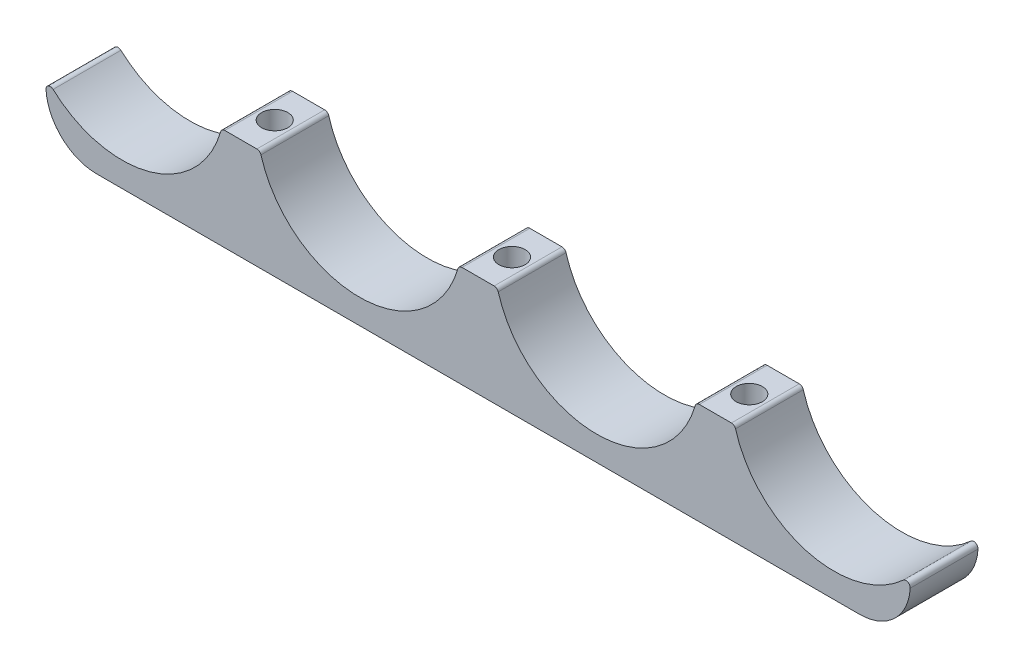
ISO-10303-21;
HEADER;
FILE_DESCRIPTION(('STEP AP214'),'2;1');
FILE_NAME('part.step','',(''),(''),'','','');
FILE_SCHEMA(('AUTOMOTIVE_DESIGN { 1 0 10303 214 1 1 1 1 }'));
ENDSEC;
DATA;
#1=APPLICATION_CONTEXT('core data for automotive mechanical design processes');
#2=APPLICATION_PROTOCOL_DEFINITION('international standard','automotive_design',2000,#1);
#3=PRODUCT_CONTEXT('',#1,'mechanical');
#4=PRODUCT('Part','Part','',(#3));
#5=PRODUCT_RELATED_PRODUCT_CATEGORY('part','',(#4));
#6=PRODUCT_DEFINITION_FORMATION('','',#4);
#7=PRODUCT_DEFINITION_CONTEXT('part definition',#1,'design');
#8=PRODUCT_DEFINITION('design','',#6,#7);
#9=PRODUCT_DEFINITION_SHAPE('','',#8);
#10=(LENGTH_UNIT() NAMED_UNIT(*) SI_UNIT(.MILLI.,.METRE.));
#11=(NAMED_UNIT(*) PLANE_ANGLE_UNIT() SI_UNIT($,.RADIAN.));
#12=(NAMED_UNIT(*) SI_UNIT($,.STERADIAN.) SOLID_ANGLE_UNIT());
#13=UNCERTAINTY_MEASURE_WITH_UNIT(LENGTH_MEASURE(1.E-05),#10,'distance_accuracy_value','');
#14=(GEOMETRIC_REPRESENTATION_CONTEXT(3) GLOBAL_UNCERTAINTY_ASSIGNED_CONTEXT((#13)) GLOBAL_UNIT_ASSIGNED_CONTEXT((#10,
#11,#12)) REPRESENTATION_CONTEXT('',''));
#15=CARTESIAN_POINT('',(0.,0.,0.));
#16=DIRECTION('',(0.,0.,1.));
#17=DIRECTION('',(1.,0.,0.));
#18=AXIS2_PLACEMENT_3D('',#15,#16,#17);
#19=CARTESIAN_POINT('',(-14.,15.,4.));
#20=DIRECTION('',(0.,0.,-1.));
#21=DIRECTION('',(-1.,0.,0.));
#22=AXIS2_PLACEMENT_3D('',#19,#20,#21);
#23=CYLINDRICAL_SURFACE('',#22,12.1);
#24=CARTESIAN_POINT('',(-14.,15.,4.));
#25=DIRECTION('',(0.,0.,-1.));
#26=DIRECTION('',(1.,0.,0.));
#27=AXIS2_PLACEMENT_3D('',#24,#25,#26);
#28=CIRCLE('',#27,12.1);
#29=CARTESIAN_POINT('',(-2.37619115355189,11.6388888888889,4.));
#30=VERTEX_POINT('',#29);
#31=CARTESIAN_POINT('',(-25.6238088464481,11.6388888888889,4.));
#32=VERTEX_POINT('',#31);
#33=EDGE_CURVE('E199',#30,#32,#28,.T.);
#34=ORIENTED_EDGE('',*,*,#33,.F.);
#35=DIRECTION('',(0.,0.,-1.));
#36=VECTOR('',#35,1.);
#37=CARTESIAN_POINT('',(-2.37619115355189,11.6388888888889,4.));
#38=LINE('',#37,#36);
#39=CARTESIAN_POINT('',(-2.37619115355189,11.6388888888889,-4.));
#40=VERTEX_POINT('',#39);
#41=EDGE_CURVE('E263',#30,#40,#38,.T.);
#42=ORIENTED_EDGE('',*,*,#41,.T.);
#43=CARTESIAN_POINT('',(-14.,15.,-4.));
#44=DIRECTION('',(0.,0.,-1.));
#45=DIRECTION('',(1.,0.,0.));
#46=AXIS2_PLACEMENT_3D('',#43,#44,#45);
#47=CIRCLE('',#46,12.1);
#48=CARTESIAN_POINT('',(-25.6238088464481,11.6388888888889,-4.));
#49=VERTEX_POINT('',#48);
#50=EDGE_CURVE('E361',#40,#49,#47,.T.);
#51=ORIENTED_EDGE('',*,*,#50,.T.);
#52=DIRECTION('',(0.,0.,-1.));
#53=VECTOR('',#52,1.);
#54=CARTESIAN_POINT('',(-25.6238088464481,11.6388888888889,4.));
#55=LINE('',#54,#53);
#56=EDGE_CURVE('E261',#49,#32,#55,.F.);
#57=ORIENTED_EDGE('',*,*,#56,.T.);
#58=EDGE_LOOP('',(#34,#42,#51,#57));
#59=FACE_BOUND('',#58,.T.);
#60=ADVANCED_FACE('F32',(#59),#23,.F.);
#61=CARTESIAN_POINT('',(-30.2777988415144,12.,4.));
#62=DIRECTION('',(0.,-1.,0.));
#63=DIRECTION('',(0.,0.,-1.));
#64=AXIS2_PLACEMENT_3D('',#61,#62,#63);
#65=PLANE('',#64);
#66=CARTESIAN_POINT('',(-28.,12.,0.));
#67=DIRECTION('',(0.,1.,0.));
#68=DIRECTION('',(0.,0.,1.));
#69=AXIS2_PLACEMENT_3D('',#66,#67,#68);
#70=CIRCLE('',#69,1.54999999999999);
#71=CARTESIAN_POINT('',(-28.,12.,1.54999999999999));
#72=VERTEX_POINT('',#71);
#73=EDGE_CURVE('E692',#72,#72,#70,.T.);
#74=ORIENTED_EDGE('',*,*,#73,.F.);
#75=EDGE_LOOP('',(#74));
#76=FACE_BOUND('',#75,.T.);
#77=DIRECTION('',(-1.,0.,0.));
#78=VECTOR('',#77,1.);
#79=CARTESIAN_POINT('',(-30.2777988415144,12.,4.));
#80=LINE('',#79,#78);
#81=CARTESIAN_POINT('',(-26.1041315260534,12.,4.));
#82=VERTEX_POINT('',#81);
#83=CARTESIAN_POINT('',(-29.8958684739466,12.,4.));
#84=VERTEX_POINT('',#83);
#85=EDGE_CURVE('E341',#82,#84,#80,.T.);
#86=ORIENTED_EDGE('',*,*,#85,.F.);
#87=DIRECTION('',(0.,0.,-1.));
#88=VECTOR('',#87,1.);
#89=CARTESIAN_POINT('',(-26.1041315260534,12.,4.));
#90=LINE('',#89,#88);
#91=CARTESIAN_POINT('',(-26.1041315260534,12.,-4.));
#92=VERTEX_POINT('',#91);
#93=EDGE_CURVE('E268',#82,#92,#90,.T.);
#94=ORIENTED_EDGE('',*,*,#93,.T.);
#95=DIRECTION('',(-1.,0.,0.));
#96=VECTOR('',#95,1.);
#97=CARTESIAN_POINT('',(-30.2777988415144,12.,-4.));
#98=LINE('',#97,#96);
#99=CARTESIAN_POINT('',(-29.8958684739466,12.,-4.));
#100=VERTEX_POINT('',#99);
#101=EDGE_CURVE('E188',#92,#100,#98,.T.);
#102=ORIENTED_EDGE('',*,*,#101,.T.);
#103=DIRECTION('',(0.,0.,-1.));
#104=VECTOR('',#103,1.);
#105=CARTESIAN_POINT('',(-29.8958684739466,12.,4.));
#106=LINE('',#105,#104);
#107=EDGE_CURVE('E266',#100,#84,#106,.F.);
#108=ORIENTED_EDGE('',*,*,#107,.T.);
#109=EDGE_LOOP('',(#86,#94,#102,#108));
#110=FACE_BOUND('',#109,.T.);
#111=ADVANCED_FACE('F293',(#76,#110),#65,.F.);
#112=CARTESIAN_POINT('',(-42.,15.,4.));
#113=DIRECTION('',(0.,0.,-1.));
#114=DIRECTION('',(-1.,0.,0.));
#115=AXIS2_PLACEMENT_3D('',#112,#113,#114);
#116=CYLINDRICAL_SURFACE('',#115,12.1);
#117=CARTESIAN_POINT('',(-42.,15.,4.));
#118=DIRECTION('',(0.,0.,-1.));
#119=DIRECTION('',(1.,0.,0.));
#120=AXIS2_PLACEMENT_3D('',#117,#118,#119);
#121=CIRCLE('',#120,12.1);
#122=CARTESIAN_POINT('',(-30.3761911535519,11.6388888888889,4.));
#123=VERTEX_POINT('',#122);
#124=CARTESIAN_POINT('',(-50.1543558094259,6.06039814458816,4.));
#125=VERTEX_POINT('',#124);
#126=EDGE_CURVE('E275',#123,#125,#121,.T.);
#127=ORIENTED_EDGE('',*,*,#126,.F.);
#128=DIRECTION('',(0.,0.,-1.));
#129=VECTOR('',#128,1.);
#130=CARTESIAN_POINT('',(-30.3761911535519,11.6388888888889,4.));
#131=LINE('',#130,#129);
#132=CARTESIAN_POINT('',(-30.3761911535519,11.6388888888889,-4.));
#133=VERTEX_POINT('',#132);
#134=EDGE_CURVE('E40',#123,#133,#131,.T.);
#135=ORIENTED_EDGE('',*,*,#134,.T.);
#136=CARTESIAN_POINT('',(-42.,15.,-4.));
#137=DIRECTION('',(0.,0.,-1.));
#138=DIRECTION('',(1.,0.,0.));
#139=AXIS2_PLACEMENT_3D('',#136,#137,#138);
#140=CIRCLE('',#139,12.1);
#141=CARTESIAN_POINT('',(-50.1543558094259,6.06039814458816,-4.));
#142=VERTEX_POINT('',#141);
#143=EDGE_CURVE('E183',#133,#142,#140,.T.);
#144=ORIENTED_EDGE('',*,*,#143,.T.);
#145=DIRECTION('',(0.,0.,-1.));
#146=VECTOR('',#145,1.);
#147=CARTESIAN_POINT('',(-50.1543558094259,6.06039814458816,4.));
#148=LINE('',#147,#146);
#149=EDGE_CURVE('E55',#142,#125,#148,.F.);
#150=ORIENTED_EDGE('',*,*,#149,.T.);
#151=EDGE_LOOP('',(#127,#135,#144,#150));
#152=FACE_BOUND('',#151,.T.);
#153=ADVANCED_FACE('F274',(#152),#116,.F.);
#154=CARTESIAN_POINT('',(-51.,0.,4.));
#155=DIRECTION('',(0.,1.,0.));
#156=DIRECTION('',(0.,0.,1.));
#157=AXIS2_PLACEMENT_3D('',#154,#155,#156);
#158=PLANE('',#157);
#159=CARTESIAN_POINT('',(28.,0.,0.));
#160=DIRECTION('',(0.,1.,0.));
#161=DIRECTION('',(0.,0.,1.));
#162=AXIS2_PLACEMENT_3D('',#159,#160,#161);
#163=CIRCLE('',#162,3.1);
#164=CARTESIAN_POINT('',(28.,0.,3.1));
#165=VERTEX_POINT('',#164);
#166=EDGE_CURVE('E713',#165,#165,#163,.T.);
#167=ORIENTED_EDGE('',*,*,#166,.T.);
#168=EDGE_LOOP('',(#167));
#169=FACE_BOUND('',#168,.T.);
#170=CARTESIAN_POINT('',(0.,0.,0.));
#171=DIRECTION('',(0.,1.,0.));
#172=DIRECTION('',(0.,0.,1.));
#173=AXIS2_PLACEMENT_3D('',#170,#171,#172);
#174=CIRCLE('',#173,3.1);
#175=CARTESIAN_POINT('',(0.,0.,3.1));
#176=VERTEX_POINT('',#175);
#177=EDGE_CURVE('E695',#176,#176,#174,.T.);
#178=ORIENTED_EDGE('',*,*,#177,.T.);
#179=EDGE_LOOP('',(#178));
#180=FACE_BOUND('',#179,.T.);
#181=CARTESIAN_POINT('',(-28.,0.,0.));
#182=DIRECTION('',(0.,1.,0.));
#183=DIRECTION('',(0.,0.,1.));
#184=AXIS2_PLACEMENT_3D('',#181,#182,#183);
#185=CIRCLE('',#184,3.1);
#186=CARTESIAN_POINT('',(-28.,0.,3.1));
#187=VERTEX_POINT('',#186);
#188=EDGE_CURVE('E363',#187,#187,#185,.T.);
#189=ORIENTED_EDGE('',*,*,#188,.T.);
#190=EDGE_LOOP('',(#189));
#191=FACE_BOUND('',#190,.T.);
#192=DIRECTION('',(1.,0.,0.));
#193=VECTOR('',#192,1.);
#194=CARTESIAN_POINT('',(-51.,0.,-4.));
#195=LINE('',#194,#193);
#196=CARTESIAN_POINT('',(-45.,0.,-4.));
#197=VERTEX_POINT('',#196);
#198=CARTESIAN_POINT('',(45.,0.,-4.));
#199=VERTEX_POINT('',#198);
#200=EDGE_CURVE('E173',#197,#199,#195,.T.);
#201=ORIENTED_EDGE('',*,*,#200,.T.);
#202=DIRECTION('',(0.,0.,-1.));
#203=VECTOR('',#202,1.);
#204=CARTESIAN_POINT('',(45.,0.,4.));
#205=LINE('',#204,#203);
#206=CARTESIAN_POINT('',(45.,0.,4.));
#207=VERTEX_POINT('',#206);
#208=EDGE_CURVE('E177',#199,#207,#205,.F.);
#209=ORIENTED_EDGE('',*,*,#208,.T.);
#210=DIRECTION('',(1.,0.,0.));
#211=VECTOR('',#210,1.);
#212=CARTESIAN_POINT('',(-51.,0.,4.));
#213=LINE('',#212,#211);
#214=CARTESIAN_POINT('',(-45.,0.,4.));
#215=VERTEX_POINT('',#214);
#216=EDGE_CURVE('E176',#215,#207,#213,.T.);
#217=ORIENTED_EDGE('',*,*,#216,.F.);
#218=DIRECTION('',(0.,0.,-1.));
#219=VECTOR('',#218,1.);
#220=CARTESIAN_POINT('',(-45.,0.,4.));
#221=LINE('',#220,#219);
#222=EDGE_CURVE('E162',#215,#197,#221,.T.);
#223=ORIENTED_EDGE('',*,*,#222,.T.);
#224=EDGE_LOOP('',(#201,#209,#217,#223));
#225=FACE_BOUND('',#224,.T.);
#226=ADVANCED_FACE('F172',(#169,#180,#191,#225),#158,.F.);
#227=CARTESIAN_POINT('',(42.,15.,4.));
#228=DIRECTION('',(0.,0.,-1.));
#229=DIRECTION('',(-1.,0.,0.));
#230=AXIS2_PLACEMENT_3D('',#227,#228,#229);
#231=CYLINDRICAL_SURFACE('',#230,12.1);
#232=CARTESIAN_POINT('',(42.,15.,4.));
#233=DIRECTION('',(0.,0.,-1.));
#234=DIRECTION('',(-1.,0.,0.));
#235=AXIS2_PLACEMENT_3D('',#232,#233,#234);
#236=CIRCLE('',#235,12.1);
#237=CARTESIAN_POINT('',(50.1543558094259,6.06039814458816,4.));
#238=VERTEX_POINT('',#237);
#239=CARTESIAN_POINT('',(30.3761911535519,11.6388888888889,4.));
#240=VERTEX_POINT('',#239);
#241=EDGE_CURVE('E350',#238,#240,#236,.T.);
#242=ORIENTED_EDGE('',*,*,#241,.F.);
#243=DIRECTION('',(0.,0.,-1.));
#244=VECTOR('',#243,1.);
#245=CARTESIAN_POINT('',(50.1543558094259,6.06039814458816,4.));
#246=LINE('',#245,#244);
#247=CARTESIAN_POINT('',(50.1543558094259,6.06039814458816,-4.));
#248=VERTEX_POINT('',#247);
#249=EDGE_CURVE('E210',#238,#248,#246,.T.);
#250=ORIENTED_EDGE('',*,*,#249,.T.);
#251=CARTESIAN_POINT('',(42.,15.,-4.));
#252=DIRECTION('',(0.,0.,-1.));
#253=DIRECTION('',(-1.,0.,0.));
#254=AXIS2_PLACEMENT_3D('',#251,#252,#253);
#255=CIRCLE('',#254,12.1);
#256=CARTESIAN_POINT('',(30.3761911535519,11.6388888888889,-4.));
#257=VERTEX_POINT('',#256);
#258=EDGE_CURVE('E182',#248,#257,#255,.T.);
#259=ORIENTED_EDGE('',*,*,#258,.T.);
#260=DIRECTION('',(0.,0.,-1.));
#261=VECTOR('',#260,1.);
#262=CARTESIAN_POINT('',(30.3761911535519,11.6388888888889,4.));
#263=LINE('',#262,#261);
#264=EDGE_CURVE('E208',#257,#240,#263,.F.);
#265=ORIENTED_EDGE('',*,*,#264,.T.);
#266=EDGE_LOOP('',(#242,#250,#259,#265));
#267=FACE_BOUND('',#266,.T.);
#268=ADVANCED_FACE('F391',(#267),#231,.F.);
#269=CARTESIAN_POINT('',(25.7222011584856,12.,4.));
#270=DIRECTION('',(0.,-1.,0.));
#271=DIRECTION('',(0.,0.,-1.));
#272=AXIS2_PLACEMENT_3D('',#269,#270,#271);
#273=PLANE('',#272);
#274=CARTESIAN_POINT('',(28.,12.,0.));
#275=DIRECTION('',(0.,1.,0.));
#276=DIRECTION('',(0.,0.,1.));
#277=AXIS2_PLACEMENT_3D('',#274,#275,#276);
#278=CIRCLE('',#277,1.54999999999999);
#279=CARTESIAN_POINT('',(28.,12.,1.54999999999999));
#280=VERTEX_POINT('',#279);
#281=EDGE_CURVE('E728',#280,#280,#278,.T.);
#282=ORIENTED_EDGE('',*,*,#281,.F.);
#283=EDGE_LOOP('',(#282));
#284=FACE_BOUND('',#283,.T.);
#285=DIRECTION('',(-1.,0.,0.));
#286=VECTOR('',#285,1.);
#287=CARTESIAN_POINT('',(25.7222011584856,12.,4.));
#288=LINE('',#287,#286);
#289=CARTESIAN_POINT('',(29.8958684739466,12.,4.));
#290=VERTEX_POINT('',#289);
#291=CARTESIAN_POINT('',(26.1041315260534,12.,4.));
#292=VERTEX_POINT('',#291);
#293=EDGE_CURVE('E353',#290,#292,#288,.T.);
#294=ORIENTED_EDGE('',*,*,#293,.F.);
#295=DIRECTION('',(0.,0.,-1.));
#296=VECTOR('',#295,1.);
#297=CARTESIAN_POINT('',(29.8958684739466,12.,4.));
#298=LINE('',#297,#296);
#299=CARTESIAN_POINT('',(29.8958684739466,12.,-4.));
#300=VERTEX_POINT('',#299);
#301=EDGE_CURVE('E248',#290,#300,#298,.T.);
#302=ORIENTED_EDGE('',*,*,#301,.T.);
#303=DIRECTION('',(-1.,0.,0.));
#304=VECTOR('',#303,1.);
#305=CARTESIAN_POINT('',(25.7222011584856,12.,-4.));
#306=LINE('',#305,#304);
#307=CARTESIAN_POINT('',(26.1041315260534,12.,-4.));
#308=VERTEX_POINT('',#307);
#309=EDGE_CURVE('E186',#300,#308,#306,.T.);
#310=ORIENTED_EDGE('',*,*,#309,.T.);
#311=DIRECTION('',(0.,0.,-1.));
#312=VECTOR('',#311,1.);
#313=CARTESIAN_POINT('',(26.1041315260534,12.,4.));
#314=LINE('',#313,#312);
#315=EDGE_CURVE('E246',#308,#292,#314,.F.);
#316=ORIENTED_EDGE('',*,*,#315,.T.);
#317=EDGE_LOOP('',(#294,#302,#310,#316));
#318=FACE_BOUND('',#317,.T.);
#319=ADVANCED_FACE('F385',(#284,#318),#273,.F.);
#320=CARTESIAN_POINT('',(14.,15.,4.));
#321=DIRECTION('',(0.,0.,-1.));
#322=DIRECTION('',(-1.,0.,0.));
#323=AXIS2_PLACEMENT_3D('',#320,#321,#322);
#324=CYLINDRICAL_SURFACE('',#323,12.1);
#325=CARTESIAN_POINT('',(14.,15.,4.));
#326=DIRECTION('',(0.,0.,-1.));
#327=DIRECTION('',(-1.,0.,0.));
#328=AXIS2_PLACEMENT_3D('',#325,#326,#327);
#329=CIRCLE('',#328,12.1);
#330=CARTESIAN_POINT('',(25.6238088464481,11.6388888888889,4.));
#331=VERTEX_POINT('',#330);
#332=CARTESIAN_POINT('',(2.37619115355189,11.6388888888889,4.));
#333=VERTEX_POINT('',#332);
#334=EDGE_CURVE('E356',#331,#333,#329,.T.);
#335=ORIENTED_EDGE('',*,*,#334,.F.);
#336=DIRECTION('',(0.,0.,-1.));
#337=VECTOR('',#336,1.);
#338=CARTESIAN_POINT('',(25.6238088464481,11.6388888888889,4.));
#339=LINE('',#338,#337);
#340=CARTESIAN_POINT('',(25.6238088464481,11.6388888888889,-4.));
#341=VERTEX_POINT('',#340);
#342=EDGE_CURVE('E253',#331,#341,#339,.T.);
#343=ORIENTED_EDGE('',*,*,#342,.T.);
#344=CARTESIAN_POINT('',(14.,15.,-4.));
#345=DIRECTION('',(0.,0.,-1.));
#346=DIRECTION('',(-1.,0.,0.));
#347=AXIS2_PLACEMENT_3D('',#344,#345,#346);
#348=CIRCLE('',#347,12.1);
#349=CARTESIAN_POINT('',(2.37619115355189,11.6388888888889,-4.));
#350=VERTEX_POINT('',#349);
#351=EDGE_CURVE('E194',#341,#350,#348,.T.);
#352=ORIENTED_EDGE('',*,*,#351,.T.);
#353=DIRECTION('',(0.,0.,-1.));
#354=VECTOR('',#353,1.);
#355=CARTESIAN_POINT('',(2.37619115355189,11.6388888888889,4.));
#356=LINE('',#355,#354);
#357=EDGE_CURVE('E251',#350,#333,#356,.F.);
#358=ORIENTED_EDGE('',*,*,#357,.T.);
#359=EDGE_LOOP('',(#335,#343,#352,#358));
#360=FACE_BOUND('',#359,.T.);
#361=ADVANCED_FACE('F378',(#360),#324,.F.);
#362=CARTESIAN_POINT('',(-2.27779884151445,12.,4.));
#363=DIRECTION('',(0.,-1.,0.));
#364=DIRECTION('',(0.,0.,-1.));
#365=AXIS2_PLACEMENT_3D('',#362,#363,#364);
#366=PLANE('',#365);
#367=CARTESIAN_POINT('',(0.,12.,0.));
#368=DIRECTION('',(0.,1.,0.));
#369=DIRECTION('',(0.,0.,1.));
#370=AXIS2_PLACEMENT_3D('',#367,#368,#369);
#371=CIRCLE('',#370,1.54999999999999);
#372=CARTESIAN_POINT('',(0.,12.,1.54999999999999));
#373=VERTEX_POINT('',#372);
#374=EDGE_CURVE('E710',#373,#373,#371,.T.);
#375=ORIENTED_EDGE('',*,*,#374,.F.);
#376=EDGE_LOOP('',(#375));
#377=FACE_BOUND('',#376,.T.);
#378=DIRECTION('',(-1.,0.,0.));
#379=VECTOR('',#378,1.);
#380=CARTESIAN_POINT('',(-2.27779884151445,12.,4.));
#381=LINE('',#380,#379);
#382=CARTESIAN_POINT('',(1.89586847394659,12.,4.));
#383=VERTEX_POINT('',#382);
#384=CARTESIAN_POINT('',(-1.89586847394659,12.,4.));
#385=VERTEX_POINT('',#384);
#386=EDGE_CURVE('E167',#383,#385,#381,.T.);
#387=ORIENTED_EDGE('',*,*,#386,.F.);
#388=DIRECTION('',(0.,0.,-1.));
#389=VECTOR('',#388,1.);
#390=CARTESIAN_POINT('',(1.89586847394659,12.,4.));
#391=LINE('',#390,#389);
#392=CARTESIAN_POINT('',(1.89586847394659,12.,-4.));
#393=VERTEX_POINT('',#392);
#394=EDGE_CURVE('E258',#383,#393,#391,.T.);
#395=ORIENTED_EDGE('',*,*,#394,.T.);
#396=DIRECTION('',(-1.,0.,0.));
#397=VECTOR('',#396,1.);
#398=CARTESIAN_POINT('',(-2.27779884151445,12.,-4.));
#399=LINE('',#398,#397);
#400=CARTESIAN_POINT('',(-1.89586847394659,12.,-4.));
#401=VERTEX_POINT('',#400);
#402=EDGE_CURVE('E197',#393,#401,#399,.T.);
#403=ORIENTED_EDGE('',*,*,#402,.T.);
#404=DIRECTION('',(0.,0.,-1.));
#405=VECTOR('',#404,1.);
#406=CARTESIAN_POINT('',(-1.89586847394659,12.,4.));
#407=LINE('',#406,#405);
#408=EDGE_CURVE('E256',#401,#385,#407,.F.);
#409=ORIENTED_EDGE('',*,*,#408,.T.);
#410=EDGE_LOOP('',(#387,#395,#403,#409));
#411=FACE_BOUND('',#410,.T.);
#412=ADVANCED_FACE('F371',(#377,#411),#366,.F.);
#413=CARTESIAN_POINT('',(-14.,15.,4.));
#414=DIRECTION('',(0.,0.,1.));
#415=DIRECTION('',(1.,0.,0.));
#416=AXIS2_PLACEMENT_3D('',#413,#414,#415);
#417=PLANE('',#416);
#418=CARTESIAN_POINT('',(45.,6.,4.));
#419=DIRECTION('',(0.,0.,1.));
#420=DIRECTION('',(1.,0.,0.));
#421=AXIS2_PLACEMENT_3D('',#418,#419,#420);
#422=CIRCLE('',#421,6.);
#423=CARTESIAN_POINT('',(50.9905229029691,5.66290157371698,4.));
#424=VERTEX_POINT('',#423);
#425=EDGE_CURVE('E205',#207,#424,#422,.T.);
#426=ORIENTED_EDGE('',*,*,#425,.T.);
#427=CARTESIAN_POINT('',(50.491312661055,5.69099310924056,4.));
#428=DIRECTION('',(0.,0.,1.));
#429=DIRECTION('',(1.,0.,0.));
#430=AXIS2_PLACEMENT_3D('',#427,#428,#429);
#431=CIRCLE('',#430,0.5);
#432=EDGE_CURVE('E244',#424,#238,#431,.T.);
#433=ORIENTED_EDGE('',*,*,#432,.T.);
#434=ORIENTED_EDGE('',*,*,#241,.T.);
#435=CARTESIAN_POINT('',(29.8958684739466,11.5,4.));
#436=DIRECTION('',(0.,0.,1.));
#437=DIRECTION('',(1.,0.,0.));
#438=AXIS2_PLACEMENT_3D('',#435,#436,#437);
#439=CIRCLE('',#438,0.5);
#440=EDGE_CURVE('E242',#240,#290,#439,.T.);
#441=ORIENTED_EDGE('',*,*,#440,.T.);
#442=ORIENTED_EDGE('',*,*,#293,.T.);
#443=CARTESIAN_POINT('',(26.1041315260534,11.5,4.));
#444=DIRECTION('',(0.,0.,1.));
#445=DIRECTION('',(1.,0.,0.));
#446=AXIS2_PLACEMENT_3D('',#443,#444,#445);
#447=CIRCLE('',#446,0.5);
#448=EDGE_CURVE('E240',#292,#331,#447,.T.);
#449=ORIENTED_EDGE('',*,*,#448,.T.);
#450=ORIENTED_EDGE('',*,*,#334,.T.);
#451=CARTESIAN_POINT('',(1.89586847394659,11.5,4.));
#452=DIRECTION('',(0.,0.,1.));
#453=DIRECTION('',(1.,0.,0.));
#454=AXIS2_PLACEMENT_3D('',#451,#452,#453);
#455=CIRCLE('',#454,0.5);
#456=EDGE_CURVE('E238',#333,#383,#455,.T.);
#457=ORIENTED_EDGE('',*,*,#456,.T.);
#458=ORIENTED_EDGE('',*,*,#386,.T.);
#459=CARTESIAN_POINT('',(-1.89586847394659,11.5,4.));
#460=DIRECTION('',(0.,0.,1.));
#461=DIRECTION('',(1.,0.,0.));
#462=AXIS2_PLACEMENT_3D('',#459,#460,#461);
#463=CIRCLE('',#462,0.5);
#464=EDGE_CURVE('E236',#385,#30,#463,.T.);
#465=ORIENTED_EDGE('',*,*,#464,.T.);
#466=ORIENTED_EDGE('',*,*,#33,.T.);
#467=CARTESIAN_POINT('',(-26.1041315260534,11.5,4.));
#468=DIRECTION('',(0.,0.,1.));
#469=DIRECTION('',(1.,0.,0.));
#470=AXIS2_PLACEMENT_3D('',#467,#468,#469);
#471=CIRCLE('',#470,0.5);
#472=EDGE_CURVE('E234',#32,#82,#471,.T.);
#473=ORIENTED_EDGE('',*,*,#472,.T.);
#474=ORIENTED_EDGE('',*,*,#85,.T.);
#475=CARTESIAN_POINT('',(-29.8958684739466,11.5,4.));
#476=DIRECTION('',(0.,0.,1.));
#477=DIRECTION('',(1.,0.,0.));
#478=AXIS2_PLACEMENT_3D('',#475,#476,#477);
#479=CIRCLE('',#478,0.5);
#480=EDGE_CURVE('E232',#84,#123,#479,.T.);
#481=ORIENTED_EDGE('',*,*,#480,.T.);
#482=ORIENTED_EDGE('',*,*,#126,.T.);
#483=CARTESIAN_POINT('',(-50.491312661055,5.69099310924056,4.));
#484=DIRECTION('',(0.,0.,1.));
#485=DIRECTION('',(1.,0.,0.));
#486=AXIS2_PLACEMENT_3D('',#483,#484,#485);
#487=CIRCLE('',#486,0.5);
#488=CARTESIAN_POINT('',(-50.9905229029691,5.66290157371698,4.));
#489=VERTEX_POINT('',#488);
#490=EDGE_CURVE('E47',#125,#489,#487,.T.);
#491=ORIENTED_EDGE('',*,*,#490,.T.);
#492=CARTESIAN_POINT('',(-45.,6.,4.));
#493=DIRECTION('',(0.,0.,1.));
#494=DIRECTION('',(1.,0.,0.));
#495=AXIS2_PLACEMENT_3D('',#492,#493,#494);
#496=CIRCLE('',#495,6.);
#497=EDGE_CURVE('E203',#489,#215,#496,.T.);
#498=ORIENTED_EDGE('',*,*,#497,.T.);
#499=ORIENTED_EDGE('',*,*,#216,.T.);
#500=EDGE_LOOP('',(#426,#433,#434,#441,#442,#449,#450,#457,#458,#465,#466,#473,#474,#481,#482,
#491,#498,#499));
#501=FACE_BOUND('',#500,.T.);
#502=ADVANCED_FACE('F340',(#501),#417,.T.);
#503=CARTESIAN_POINT('',(-14.,15.,-4.));
#504=DIRECTION('',(0.,0.,1.));
#505=DIRECTION('',(1.,0.,0.));
#506=AXIS2_PLACEMENT_3D('',#503,#504,#505);
#507=PLANE('',#506);
#508=ORIENTED_EDGE('',*,*,#258,.F.);
#509=CARTESIAN_POINT('',(50.491312661055,5.69099310924056,-4.));
#510=DIRECTION('',(0.,0.,1.));
#511=DIRECTION('',(1.,0.,0.));
#512=AXIS2_PLACEMENT_3D('',#509,#510,#511);
#513=CIRCLE('',#512,0.5);
#514=CARTESIAN_POINT('',(50.9905229029691,5.66290157371698,-4.));
#515=VERTEX_POINT('',#514);
#516=EDGE_CURVE('E227',#248,#515,#513,.F.);
#517=ORIENTED_EDGE('',*,*,#516,.T.);
#518=CARTESIAN_POINT('',(45.,6.,-4.));
#519=DIRECTION('',(0.,0.,1.));
#520=DIRECTION('',(1.,0.,0.));
#521=AXIS2_PLACEMENT_3D('',#518,#519,#520);
#522=CIRCLE('',#521,6.);
#523=EDGE_CURVE('E166',#515,#199,#522,.F.);
#524=ORIENTED_EDGE('',*,*,#523,.T.);
#525=ORIENTED_EDGE('',*,*,#200,.F.);
#526=CARTESIAN_POINT('',(-45.,6.,-4.));
#527=DIRECTION('',(0.,0.,1.));
#528=DIRECTION('',(1.,0.,0.));
#529=AXIS2_PLACEMENT_3D('',#526,#527,#528);
#530=CIRCLE('',#529,6.);
#531=CARTESIAN_POINT('',(-50.9905229029691,5.66290157371698,-4.));
#532=VERTEX_POINT('',#531);
#533=EDGE_CURVE('E159',#197,#532,#530,.F.);
#534=ORIENTED_EDGE('',*,*,#533,.T.);
#535=CARTESIAN_POINT('',(-50.491312661055,5.69099310924056,-4.));
#536=DIRECTION('',(0.,0.,1.));
#537=DIRECTION('',(1.,0.,0.));
#538=AXIS2_PLACEMENT_3D('',#535,#536,#537);
#539=CIRCLE('',#538,0.5);
#540=EDGE_CURVE('E213',#532,#142,#539,.F.);
#541=ORIENTED_EDGE('',*,*,#540,.T.);
#542=ORIENTED_EDGE('',*,*,#143,.F.);
#543=CARTESIAN_POINT('',(-29.8958684739466,11.5,-4.));
#544=DIRECTION('',(0.,0.,1.));
#545=DIRECTION('',(1.,0.,0.));
#546=AXIS2_PLACEMENT_3D('',#543,#544,#545);
#547=CIRCLE('',#546,0.5);
#548=EDGE_CURVE('E215',#133,#100,#547,.F.);
#549=ORIENTED_EDGE('',*,*,#548,.T.);
#550=ORIENTED_EDGE('',*,*,#101,.F.);
#551=CARTESIAN_POINT('',(-26.1041315260534,11.5,-4.));
#552=DIRECTION('',(0.,0.,1.));
#553=DIRECTION('',(1.,0.,0.));
#554=AXIS2_PLACEMENT_3D('',#551,#552,#553);
#555=CIRCLE('',#554,0.5);
#556=EDGE_CURVE('E217',#92,#49,#555,.F.);
#557=ORIENTED_EDGE('',*,*,#556,.T.);
#558=ORIENTED_EDGE('',*,*,#50,.F.);
#559=CARTESIAN_POINT('',(-1.89586847394659,11.5,-4.));
#560=DIRECTION('',(0.,0.,1.));
#561=DIRECTION('',(1.,0.,0.));
#562=AXIS2_PLACEMENT_3D('',#559,#560,#561);
#563=CIRCLE('',#562,0.5);
#564=EDGE_CURVE('E219',#40,#401,#563,.F.);
#565=ORIENTED_EDGE('',*,*,#564,.T.);
#566=ORIENTED_EDGE('',*,*,#402,.F.);
#567=CARTESIAN_POINT('',(1.89586847394659,11.5,-4.));
#568=DIRECTION('',(0.,0.,1.));
#569=DIRECTION('',(1.,0.,0.));
#570=AXIS2_PLACEMENT_3D('',#567,#568,#569);
#571=CIRCLE('',#570,0.5);
#572=EDGE_CURVE('E221',#393,#350,#571,.F.);
#573=ORIENTED_EDGE('',*,*,#572,.T.);
#574=ORIENTED_EDGE('',*,*,#351,.F.);
#575=CARTESIAN_POINT('',(26.1041315260534,11.5,-4.));
#576=DIRECTION('',(0.,0.,1.));
#577=DIRECTION('',(1.,0.,0.));
#578=AXIS2_PLACEMENT_3D('',#575,#576,#577);
#579=CIRCLE('',#578,0.5);
#580=EDGE_CURVE('E223',#341,#308,#579,.F.);
#581=ORIENTED_EDGE('',*,*,#580,.T.);
#582=ORIENTED_EDGE('',*,*,#309,.F.);
#583=CARTESIAN_POINT('',(29.8958684739466,11.5,-4.));
#584=DIRECTION('',(0.,0.,1.));
#585=DIRECTION('',(1.,0.,0.));
#586=AXIS2_PLACEMENT_3D('',#583,#584,#585);
#587=CIRCLE('',#586,0.5);
#588=EDGE_CURVE('E225',#300,#257,#587,.F.);
#589=ORIENTED_EDGE('',*,*,#588,.T.);
#590=EDGE_LOOP('',(#508,#517,#524,#525,#534,#541,#542,#549,#550,#557,#558,#565,#566,#573,#574,
#581,#582,#589));
#591=FACE_BOUND('',#590,.T.);
#592=ADVANCED_FACE('F180',(#591),#507,.F.);
#593=CARTESIAN_POINT('',(45.,6.,4.));
#594=DIRECTION('',(0.,0.,-1.));
#595=DIRECTION('',(-1.,0.,0.));
#596=AXIS2_PLACEMENT_3D('',#593,#594,#595);
#597=CYLINDRICAL_SURFACE('',#596,6.);
#598=ORIENTED_EDGE('',*,*,#523,.F.);
#599=DIRECTION('',(0.,0.,-1.));
#600=VECTOR('',#599,1.);
#601=CARTESIAN_POINT('',(50.9905229029691,5.66290157371698,4.));
#602=LINE('',#601,#600);
#603=EDGE_CURVE('E229',#515,#424,#602,.F.);
#604=ORIENTED_EDGE('',*,*,#603,.T.);
#605=ORIENTED_EDGE('',*,*,#425,.F.);
#606=ORIENTED_EDGE('',*,*,#208,.F.);
#607=EDGE_LOOP('',(#598,#604,#605,#606));
#608=FACE_BOUND('',#607,.T.);
#609=ADVANCED_FACE('F304',(#608),#597,.T.);
#610=CARTESIAN_POINT('',(-45.,6.,4.));
#611=DIRECTION('',(0.,0.,-1.));
#612=DIRECTION('',(-1.,0.,0.));
#613=AXIS2_PLACEMENT_3D('',#610,#611,#612);
#614=CYLINDRICAL_SURFACE('',#613,6.);
#615=ORIENTED_EDGE('',*,*,#497,.F.);
#616=DIRECTION('',(0.,0.,-1.));
#617=VECTOR('',#616,1.);
#618=CARTESIAN_POINT('',(-50.9905229029691,5.66290157371698,4.));
#619=LINE('',#618,#617);
#620=EDGE_CURVE('E11',#489,#532,#619,.T.);
#621=ORIENTED_EDGE('',*,*,#620,.T.);
#622=ORIENTED_EDGE('',*,*,#533,.F.);
#623=ORIENTED_EDGE('',*,*,#222,.F.);
#624=EDGE_LOOP('',(#615,#621,#622,#623));
#625=FACE_BOUND('',#624,.T.);
#626=ADVANCED_FACE('F161',(#625),#614,.T.);
#627=CARTESIAN_POINT('',(50.491312661055,5.69099310924056,4.));
#628=DIRECTION('',(0.,0.,1.));
#629=DIRECTION('',(1.,0.,0.));
#630=AXIS2_PLACEMENT_3D('',#627,#628,#629);
#631=CYLINDRICAL_SURFACE('',#630,0.5);
#632=ORIENTED_EDGE('',*,*,#432,.F.);
#633=ORIENTED_EDGE('',*,*,#603,.F.);
#634=ORIENTED_EDGE('',*,*,#516,.F.);
#635=ORIENTED_EDGE('',*,*,#249,.F.);
#636=EDGE_LOOP('',(#632,#633,#634,#635));
#637=FACE_BOUND('',#636,.T.);
#638=ADVANCED_FACE('F310',(#637),#631,.T.);
#639=CARTESIAN_POINT('',(29.8958684739466,11.5,4.));
#640=DIRECTION('',(0.,0.,-1.));
#641=DIRECTION('',(-1.,0.,0.));
#642=AXIS2_PLACEMENT_3D('',#639,#640,#641);
#643=CYLINDRICAL_SURFACE('',#642,0.5);
#644=ORIENTED_EDGE('',*,*,#440,.F.);
#645=ORIENTED_EDGE('',*,*,#264,.F.);
#646=ORIENTED_EDGE('',*,*,#588,.F.);
#647=ORIENTED_EDGE('',*,*,#301,.F.);
#648=EDGE_LOOP('',(#644,#645,#646,#647));
#649=FACE_BOUND('',#648,.T.);
#650=ADVANCED_FACE('F313',(#649),#643,.T.);
#651=CARTESIAN_POINT('',(26.1041315260534,11.5,4.));
#652=DIRECTION('',(0.,0.,-1.));
#653=DIRECTION('',(-1.,0.,0.));
#654=AXIS2_PLACEMENT_3D('',#651,#652,#653);
#655=CYLINDRICAL_SURFACE('',#654,0.5);
#656=ORIENTED_EDGE('',*,*,#448,.F.);
#657=ORIENTED_EDGE('',*,*,#315,.F.);
#658=ORIENTED_EDGE('',*,*,#580,.F.);
#659=ORIENTED_EDGE('',*,*,#342,.F.);
#660=EDGE_LOOP('',(#656,#657,#658,#659));
#661=FACE_BOUND('',#660,.T.);
#662=ADVANCED_FACE('F317',(#661),#655,.T.);
#663=CARTESIAN_POINT('',(1.89586847394659,11.5,4.));
#664=DIRECTION('',(0.,0.,-1.));
#665=DIRECTION('',(-1.,0.,0.));
#666=AXIS2_PLACEMENT_3D('',#663,#664,#665);
#667=CYLINDRICAL_SURFACE('',#666,0.5);
#668=ORIENTED_EDGE('',*,*,#456,.F.);
#669=ORIENTED_EDGE('',*,*,#357,.F.);
#670=ORIENTED_EDGE('',*,*,#572,.F.);
#671=ORIENTED_EDGE('',*,*,#394,.F.);
#672=EDGE_LOOP('',(#668,#669,#670,#671));
#673=FACE_BOUND('',#672,.T.);
#674=ADVANCED_FACE('F321',(#673),#667,.T.);
#675=CARTESIAN_POINT('',(-1.89586847394659,11.5,4.));
#676=DIRECTION('',(0.,0.,-1.));
#677=DIRECTION('',(-1.,0.,0.));
#678=AXIS2_PLACEMENT_3D('',#675,#676,#677);
#679=CYLINDRICAL_SURFACE('',#678,0.5);
#680=ORIENTED_EDGE('',*,*,#464,.F.);
#681=ORIENTED_EDGE('',*,*,#408,.F.);
#682=ORIENTED_EDGE('',*,*,#564,.F.);
#683=ORIENTED_EDGE('',*,*,#41,.F.);
#684=EDGE_LOOP('',(#680,#681,#682,#683));
#685=FACE_BOUND('',#684,.T.);
#686=ADVANCED_FACE('F325',(#685),#679,.T.);
#687=CARTESIAN_POINT('',(-26.1041315260534,11.5,4.));
#688=DIRECTION('',(0.,0.,-1.));
#689=DIRECTION('',(-1.,0.,0.));
#690=AXIS2_PLACEMENT_3D('',#687,#688,#689);
#691=CYLINDRICAL_SURFACE('',#690,0.5);
#692=ORIENTED_EDGE('',*,*,#472,.F.);
#693=ORIENTED_EDGE('',*,*,#56,.F.);
#694=ORIENTED_EDGE('',*,*,#556,.F.);
#695=ORIENTED_EDGE('',*,*,#93,.F.);
#696=EDGE_LOOP('',(#692,#693,#694,#695));
#697=FACE_BOUND('',#696,.T.);
#698=ADVANCED_FACE('F291',(#697),#691,.T.);
#699=CARTESIAN_POINT('',(-29.8958684739466,11.5,4.));
#700=DIRECTION('',(0.,0.,-1.));
#701=DIRECTION('',(-1.,0.,0.));
#702=AXIS2_PLACEMENT_3D('',#699,#700,#701);
#703=CYLINDRICAL_SURFACE('',#702,0.5);
#704=ORIENTED_EDGE('',*,*,#480,.F.);
#705=ORIENTED_EDGE('',*,*,#107,.F.);
#706=ORIENTED_EDGE('',*,*,#548,.F.);
#707=ORIENTED_EDGE('',*,*,#134,.F.);
#708=EDGE_LOOP('',(#704,#705,#706,#707));
#709=FACE_BOUND('',#708,.T.);
#710=ADVANCED_FACE('F283',(#709),#703,.T.);
#711=CARTESIAN_POINT('',(-50.491312661055,5.69099310924056,4.));
#712=DIRECTION('',(0.,0.,1.));
#713=DIRECTION('',(1.,0.,0.));
#714=AXIS2_PLACEMENT_3D('',#711,#712,#713);
#715=CYLINDRICAL_SURFACE('',#714,0.5);
#716=ORIENTED_EDGE('',*,*,#490,.F.);
#717=ORIENTED_EDGE('',*,*,#149,.F.);
#718=ORIENTED_EDGE('',*,*,#540,.F.);
#719=ORIENTED_EDGE('',*,*,#620,.F.);
#720=EDGE_LOOP('',(#716,#717,#718,#719));
#721=FACE_BOUND('',#720,.T.);
#722=ADVANCED_FACE('F34',(#721),#715,.T.);
#723=CARTESIAN_POINT('',(-28.,0.,0.));
#724=DIRECTION('',(0.,1.,0.));
#725=DIRECTION('',(0.,0.,1.));
#726=AXIS2_PLACEMENT_3D('',#723,#724,#725);
#727=CYLINDRICAL_SURFACE('',#726,3.1);
#728=CARTESIAN_POINT('',(-28.,5.8,0.));
#729=DIRECTION('',(0.,1.,0.));
#730=DIRECTION('',(0.,0.,1.));
#731=AXIS2_PLACEMENT_3D('',#728,#729,#730);
#732=CIRCLE('',#731,3.1);
#733=CARTESIAN_POINT('',(-28.,5.8,3.1));
#734=VERTEX_POINT('',#733);
#735=EDGE_CURVE('E681',#734,#734,#732,.T.);
#736=ORIENTED_EDGE('',*,*,#735,.T.);
#737=EDGE_LOOP('',(#736));
#738=FACE_BOUND('',#737,.T.);
#739=ORIENTED_EDGE('',*,*,#188,.F.);
#740=EDGE_LOOP('',(#739));
#741=FACE_BOUND('',#740,.T.);
#742=ADVANCED_FACE('F282',(#738,#741),#727,.F.);
#743=CARTESIAN_POINT('',(-24.9,5.8,0.));
#744=DIRECTION('',(0.,-1.,0.));
#745=DIRECTION('',(0.,0.,-1.));
#746=AXIS2_PLACEMENT_3D('',#743,#744,#745);
#747=PLANE('',#746);
#748=CARTESIAN_POINT('',(-28.,5.8,0.));
#749=DIRECTION('',(0.,1.,0.));
#750=DIRECTION('',(0.,0.,1.));
#751=AXIS2_PLACEMENT_3D('',#748,#749,#750);
#752=CIRCLE('',#751,1.9);
#753=CARTESIAN_POINT('',(-28.,5.8,1.9));
#754=VERTEX_POINT('',#753);
#755=EDGE_CURVE('E678',#754,#754,#752,.T.);
#756=ORIENTED_EDGE('',*,*,#755,.T.);
#757=EDGE_LOOP('',(#756));
#758=FACE_BOUND('',#757,.T.);
#759=ORIENTED_EDGE('',*,*,#735,.F.);
#760=EDGE_LOOP('',(#759));
#761=FACE_BOUND('',#760,.T.);
#762=ADVANCED_FACE('F288',(#758,#761),#747,.T.);
#763=CARTESIAN_POINT('',(-28.,0.,0.));
#764=DIRECTION('',(0.,1.,0.));
#765=DIRECTION('',(0.,0.,1.));
#766=AXIS2_PLACEMENT_3D('',#763,#764,#765);
#767=CYLINDRICAL_SURFACE('',#766,1.9);
#768=CARTESIAN_POINT('',(-28.,9.,0.));
#769=DIRECTION('',(0.,1.,0.));
#770=DIRECTION('',(0.,0.,1.));
#771=AXIS2_PLACEMENT_3D('',#768,#769,#770);
#772=CIRCLE('',#771,1.9);
#773=CARTESIAN_POINT('',(-28.,9.,1.9));
#774=VERTEX_POINT('',#773);
#775=EDGE_CURVE('E684',#774,#774,#772,.T.);
#776=ORIENTED_EDGE('',*,*,#775,.T.);
#777=EDGE_LOOP('',(#776));
#778=FACE_BOUND('',#777,.T.);
#779=ORIENTED_EDGE('',*,*,#755,.F.);
#780=EDGE_LOOP('',(#779));
#781=FACE_BOUND('',#780,.T.);
#782=ADVANCED_FACE('F554',(#778,#781),#767,.F.);
#783=CARTESIAN_POINT('',(-26.1,9.,0.));
#784=DIRECTION('',(0.,-1.,0.));
#785=DIRECTION('',(0.,0.,-1.));
#786=AXIS2_PLACEMENT_3D('',#783,#784,#785);
#787=PLANE('',#786);
#788=CARTESIAN_POINT('',(-28.,9.,0.));
#789=DIRECTION('',(0.,1.,0.));
#790=DIRECTION('',(0.,0.,1.));
#791=AXIS2_PLACEMENT_3D('',#788,#789,#790);
#792=CIRCLE('',#791,1.54999999999999);
#793=CARTESIAN_POINT('',(-28.,9.,1.54999999999999));
#794=VERTEX_POINT('',#793);
#795=EDGE_CURVE('E689',#794,#794,#792,.T.);
#796=ORIENTED_EDGE('',*,*,#795,.T.);
#797=EDGE_LOOP('',(#796));
#798=FACE_BOUND('',#797,.T.);
#799=ORIENTED_EDGE('',*,*,#775,.F.);
#800=EDGE_LOOP('',(#799));
#801=FACE_BOUND('',#800,.T.);
#802=ADVANCED_FACE('F550',(#798,#801),#787,.T.);
#803=CARTESIAN_POINT('',(-28.,0.,0.));
#804=DIRECTION('',(0.,1.,0.));
#805=DIRECTION('',(0.,0.,1.));
#806=AXIS2_PLACEMENT_3D('',#803,#804,#805);
#807=CYLINDRICAL_SURFACE('',#806,1.54999999999999);
#808=ORIENTED_EDGE('',*,*,#73,.T.);
#809=EDGE_LOOP('',(#808));
#810=FACE_BOUND('',#809,.T.);
#811=ORIENTED_EDGE('',*,*,#795,.F.);
#812=EDGE_LOOP('',(#811));
#813=FACE_BOUND('',#812,.T.);
#814=ADVANCED_FACE('F423',(#810,#813),#807,.F.);
#815=CARTESIAN_POINT('',(0.,0.,0.));
#816=DIRECTION('',(0.,1.,0.));
#817=DIRECTION('',(0.,0.,1.));
#818=AXIS2_PLACEMENT_3D('',#815,#816,#817);
#819=CYLINDRICAL_SURFACE('',#818,3.1);
#820=CARTESIAN_POINT('',(0.,5.8,0.));
#821=DIRECTION('',(0.,1.,0.));
#822=DIRECTION('',(0.,0.,1.));
#823=AXIS2_PLACEMENT_3D('',#820,#821,#822);
#824=CIRCLE('',#823,3.1);
#825=CARTESIAN_POINT('',(0.,5.8,3.1));
#826=VERTEX_POINT('',#825);
#827=EDGE_CURVE('E698',#826,#826,#824,.T.);
#828=ORIENTED_EDGE('',*,*,#827,.T.);
#829=EDGE_LOOP('',(#828));
#830=FACE_BOUND('',#829,.T.);
#831=ORIENTED_EDGE('',*,*,#177,.F.);
#832=EDGE_LOOP('',(#831));
#833=FACE_BOUND('',#832,.T.);
#834=ADVANCED_FACE('F447',(#830,#833),#819,.F.);
#835=CARTESIAN_POINT('',(3.1,5.8,0.));
#836=DIRECTION('',(0.,-1.,0.));
#837=DIRECTION('',(0.,0.,-1.));
#838=AXIS2_PLACEMENT_3D('',#835,#836,#837);
#839=PLANE('',#838);
#840=CARTESIAN_POINT('',(0.,5.8,0.));
#841=DIRECTION('',(0.,1.,0.));
#842=DIRECTION('',(0.,0.,1.));
#843=AXIS2_PLACEMENT_3D('',#840,#841,#842);
#844=CIRCLE('',#843,1.9);
#845=CARTESIAN_POINT('',(0.,5.8,1.9));
#846=VERTEX_POINT('',#845);
#847=EDGE_CURVE('E701',#846,#846,#844,.T.);
#848=ORIENTED_EDGE('',*,*,#847,.T.);
#849=EDGE_LOOP('',(#848));
#850=FACE_BOUND('',#849,.T.);
#851=ORIENTED_EDGE('',*,*,#827,.F.);
#852=EDGE_LOOP('',(#851));
#853=FACE_BOUND('',#852,.T.);
#854=ADVANCED_FACE('F452',(#850,#853),#839,.T.);
#855=CARTESIAN_POINT('',(0.,0.,0.));
#856=DIRECTION('',(0.,1.,0.));
#857=DIRECTION('',(0.,0.,1.));
#858=AXIS2_PLACEMENT_3D('',#855,#856,#857);
#859=CYLINDRICAL_SURFACE('',#858,1.9);
#860=CARTESIAN_POINT('',(0.,9.,0.));
#861=DIRECTION('',(0.,1.,0.));
#862=DIRECTION('',(0.,0.,1.));
#863=AXIS2_PLACEMENT_3D('',#860,#861,#862);
#864=CIRCLE('',#863,1.9);
#865=CARTESIAN_POINT('',(0.,9.,1.9));
#866=VERTEX_POINT('',#865);
#867=EDGE_CURVE('E704',#866,#866,#864,.T.);
#868=ORIENTED_EDGE('',*,*,#867,.T.);
#869=EDGE_LOOP('',(#868));
#870=FACE_BOUND('',#869,.T.);
#871=ORIENTED_EDGE('',*,*,#847,.F.);
#872=EDGE_LOOP('',(#871));
#873=FACE_BOUND('',#872,.T.);
#874=ADVANCED_FACE('F462',(#870,#873),#859,.F.);
#875=CARTESIAN_POINT('',(1.9,9.,0.));
#876=DIRECTION('',(0.,-1.,0.));
#877=DIRECTION('',(0.,0.,-1.));
#878=AXIS2_PLACEMENT_3D('',#875,#876,#877);
#879=PLANE('',#878);
#880=CARTESIAN_POINT('',(0.,9.,0.));
#881=DIRECTION('',(0.,1.,0.));
#882=DIRECTION('',(0.,0.,1.));
#883=AXIS2_PLACEMENT_3D('',#880,#881,#882);
#884=CIRCLE('',#883,1.54999999999999);
#885=CARTESIAN_POINT('',(0.,9.,1.54999999999999));
#886=VERTEX_POINT('',#885);
#887=EDGE_CURVE('E707',#886,#886,#884,.T.);
#888=ORIENTED_EDGE('',*,*,#887,.T.);
#889=EDGE_LOOP('',(#888));
#890=FACE_BOUND('',#889,.T.);
#891=ORIENTED_EDGE('',*,*,#867,.F.);
#892=EDGE_LOOP('',(#891));
#893=FACE_BOUND('',#892,.T.);
#894=ADVANCED_FACE('F472',(#890,#893),#879,.T.);
#895=CARTESIAN_POINT('',(0.,0.,0.));
#896=DIRECTION('',(0.,1.,0.));
#897=DIRECTION('',(0.,0.,1.));
#898=AXIS2_PLACEMENT_3D('',#895,#896,#897);
#899=CYLINDRICAL_SURFACE('',#898,1.54999999999999);
#900=ORIENTED_EDGE('',*,*,#374,.T.);
#901=EDGE_LOOP('',(#900));
#902=FACE_BOUND('',#901,.T.);
#903=ORIENTED_EDGE('',*,*,#887,.F.);
#904=EDGE_LOOP('',(#903));
#905=FACE_BOUND('',#904,.T.);
#906=ADVANCED_FACE('F482',(#902,#905),#899,.F.);
#907=CARTESIAN_POINT('',(28.,0.,0.));
#908=DIRECTION('',(0.,1.,0.));
#909=DIRECTION('',(0.,0.,1.));
#910=AXIS2_PLACEMENT_3D('',#907,#908,#909);
#911=CYLINDRICAL_SURFACE('',#910,3.1);
#912=CARTESIAN_POINT('',(28.,5.8,0.));
#913=DIRECTION('',(0.,1.,0.));
#914=DIRECTION('',(0.,0.,1.));
#915=AXIS2_PLACEMENT_3D('',#912,#913,#914);
#916=CIRCLE('',#915,3.1);
#917=CARTESIAN_POINT('',(28.,5.8,3.1));
#918=VERTEX_POINT('',#917);
#919=EDGE_CURVE('E716',#918,#918,#916,.T.);
#920=ORIENTED_EDGE('',*,*,#919,.T.);
#921=EDGE_LOOP('',(#920));
#922=FACE_BOUND('',#921,.T.);
#923=ORIENTED_EDGE('',*,*,#166,.F.);
#924=EDGE_LOOP('',(#923));
#925=FACE_BOUND('',#924,.T.);
#926=ADVANCED_FACE('F492',(#922,#925),#911,.F.);
#927=CARTESIAN_POINT('',(31.1,5.8,0.));
#928=DIRECTION('',(0.,-1.,0.));
#929=DIRECTION('',(0.,0.,-1.));
#930=AXIS2_PLACEMENT_3D('',#927,#928,#929);
#931=PLANE('',#930);
#932=CARTESIAN_POINT('',(28.,5.8,0.));
#933=DIRECTION('',(0.,1.,0.));
#934=DIRECTION('',(0.,0.,1.));
#935=AXIS2_PLACEMENT_3D('',#932,#933,#934);
#936=CIRCLE('',#935,1.9);
#937=CARTESIAN_POINT('',(28.,5.8,1.9));
#938=VERTEX_POINT('',#937);
#939=EDGE_CURVE('E719',#938,#938,#936,.T.);
#940=ORIENTED_EDGE('',*,*,#939,.T.);
#941=EDGE_LOOP('',(#940));
#942=FACE_BOUND('',#941,.T.);
#943=ORIENTED_EDGE('',*,*,#919,.F.);
#944=EDGE_LOOP('',(#943));
#945=FACE_BOUND('',#944,.T.);
#946=ADVANCED_FACE('F502',(#942,#945),#931,.T.);
#947=CARTESIAN_POINT('',(28.,0.,0.));
#948=DIRECTION('',(0.,1.,0.));
#949=DIRECTION('',(0.,0.,1.));
#950=AXIS2_PLACEMENT_3D('',#947,#948,#949);
#951=CYLINDRICAL_SURFACE('',#950,1.9);
#952=CARTESIAN_POINT('',(28.,9.,0.));
#953=DIRECTION('',(0.,1.,0.));
#954=DIRECTION('',(0.,0.,1.));
#955=AXIS2_PLACEMENT_3D('',#952,#953,#954);
#956=CIRCLE('',#955,1.9);
#957=CARTESIAN_POINT('',(28.,9.,1.9));
#958=VERTEX_POINT('',#957);
#959=EDGE_CURVE('E722',#958,#958,#956,.T.);
#960=ORIENTED_EDGE('',*,*,#959,.T.);
#961=EDGE_LOOP('',(#960));
#962=FACE_BOUND('',#961,.T.);
#963=ORIENTED_EDGE('',*,*,#939,.F.);
#964=EDGE_LOOP('',(#963));
#965=FACE_BOUND('',#964,.T.);
#966=ADVANCED_FACE('F512',(#962,#965),#951,.F.);
#967=CARTESIAN_POINT('',(29.9,9.,0.));
#968=DIRECTION('',(0.,-1.,0.));
#969=DIRECTION('',(0.,0.,-1.));
#970=AXIS2_PLACEMENT_3D('',#967,#968,#969);
#971=PLANE('',#970);
#972=CARTESIAN_POINT('',(28.,9.,0.));
#973=DIRECTION('',(0.,1.,0.));
#974=DIRECTION('',(0.,0.,1.));
#975=AXIS2_PLACEMENT_3D('',#972,#973,#974);
#976=CIRCLE('',#975,1.54999999999999);
#977=CARTESIAN_POINT('',(28.,9.,1.54999999999999));
#978=VERTEX_POINT('',#977);
#979=EDGE_CURVE('E725',#978,#978,#976,.T.);
#980=ORIENTED_EDGE('',*,*,#979,.T.);
#981=EDGE_LOOP('',(#980));
#982=FACE_BOUND('',#981,.T.);
#983=ORIENTED_EDGE('',*,*,#959,.F.);
#984=EDGE_LOOP('',(#983));
#985=FACE_BOUND('',#984,.T.);
#986=ADVANCED_FACE('F522',(#982,#985),#971,.T.);
#987=CARTESIAN_POINT('',(28.,0.,0.));
#988=DIRECTION('',(0.,1.,0.));
#989=DIRECTION('',(0.,0.,1.));
#990=AXIS2_PLACEMENT_3D('',#987,#988,#989);
#991=CYLINDRICAL_SURFACE('',#990,1.54999999999999);
#992=ORIENTED_EDGE('',*,*,#281,.T.);
#993=EDGE_LOOP('',(#992));
#994=FACE_BOUND('',#993,.T.);
#995=ORIENTED_EDGE('',*,*,#979,.F.);
#996=EDGE_LOOP('',(#995));
#997=FACE_BOUND('',#996,.T.);
#998=ADVANCED_FACE('F532',(#994,#997),#991,.F.);
#999=CLOSED_SHELL('',(#60,#111,#153,#226,#268,#319,#361,#412,#502,#592,#609,#626,#638,#650,#662,
#674,#686,#698,#710,#722,#742,#762,#782,#802,#814,#834,#854,#874,#894,#906,#926,#946,#966,#986,#998));
#1000=MANIFOLD_SOLID_BREP('B2',#999);
#1001=ADVANCED_BREP_SHAPE_REPRESENTATION('',(#18,#1000),#14);
#1002=SHAPE_DEFINITION_REPRESENTATION(#9,#1001);
ENDSEC;
END-ISO-10303-21;
